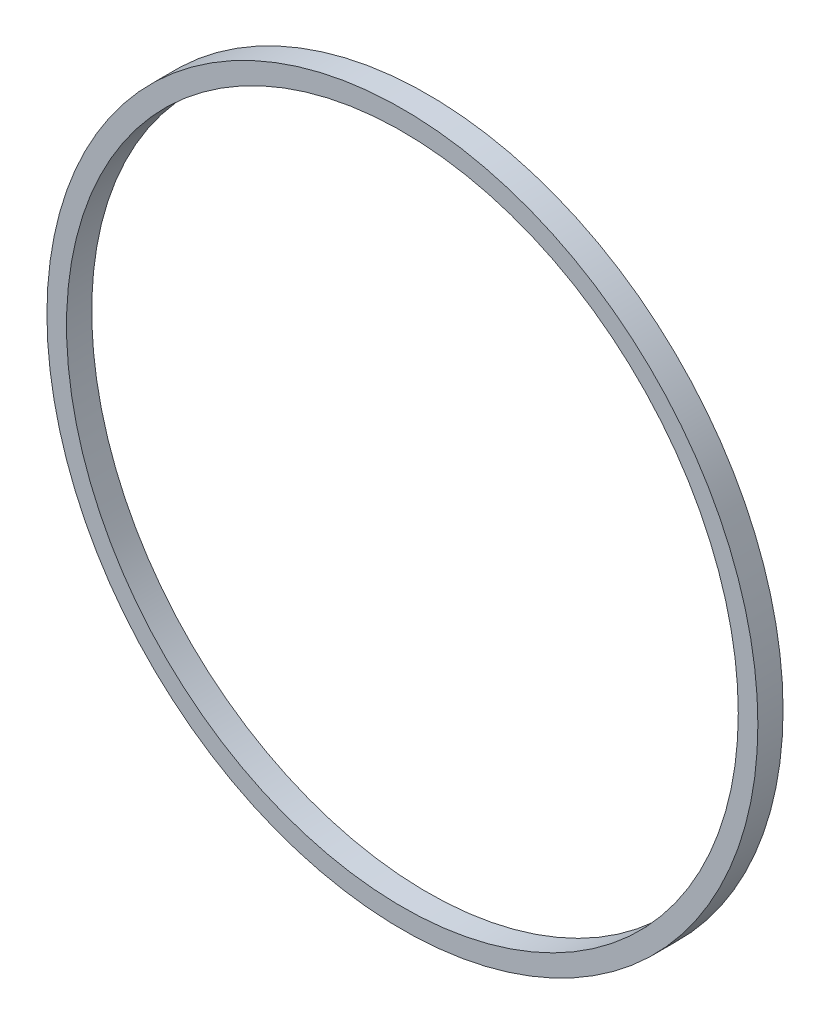
ISO-10303-21;
HEADER;
FILE_DESCRIPTION(('STEP AP214'),'2;1');
FILE_NAME('part.step','',(''),(''),'','','');
FILE_SCHEMA(('AUTOMOTIVE_DESIGN { 1 0 10303 214 1 1 1 1 }'));
ENDSEC;
DATA;
#1=APPLICATION_CONTEXT('core data for automotive mechanical design processes');
#2=APPLICATION_PROTOCOL_DEFINITION('international standard','automotive_design',2000,#1);
#3=PRODUCT_CONTEXT('',#1,'mechanical');
#4=PRODUCT('Part','Part','',(#3));
#5=PRODUCT_RELATED_PRODUCT_CATEGORY('part','',(#4));
#6=PRODUCT_DEFINITION_FORMATION('','',#4);
#7=PRODUCT_DEFINITION_CONTEXT('part definition',#1,'design');
#8=PRODUCT_DEFINITION('design','',#6,#7);
#9=PRODUCT_DEFINITION_SHAPE('','',#8);
#10=(LENGTH_UNIT() NAMED_UNIT(*) SI_UNIT(.MILLI.,.METRE.));
#11=(NAMED_UNIT(*) PLANE_ANGLE_UNIT() SI_UNIT($,.RADIAN.));
#12=(NAMED_UNIT(*) SI_UNIT($,.STERADIAN.) SOLID_ANGLE_UNIT());
#13=UNCERTAINTY_MEASURE_WITH_UNIT(LENGTH_MEASURE(1.E-05),#10,'distance_accuracy_value','');
#14=(GEOMETRIC_REPRESENTATION_CONTEXT(3) GLOBAL_UNCERTAINTY_ASSIGNED_CONTEXT((#13)) GLOBAL_UNIT_ASSIGNED_CONTEXT((#10,
#11,#12)) REPRESENTATION_CONTEXT('',''));
#15=CARTESIAN_POINT('',(0.,0.,0.));
#16=DIRECTION('',(0.,0.,1.));
#17=DIRECTION('',(1.,0.,0.));
#18=AXIS2_PLACEMENT_3D('',#15,#16,#17);
#19=CARTESIAN_POINT('',(70.1311792337737,84.2680326867237,4.5));
#20=DIRECTION('',(0.,0.,-1.));
#21=DIRECTION('',(-1.,0.,0.));
#22=AXIS2_PLACEMENT_3D('',#19,#20,#21);
#23=CYLINDRICAL_SURFACE('',#22,60.);
#24=CARTESIAN_POINT('',(70.1311792337737,84.2680326867237,4.5));
#25=DIRECTION('',(0.,0.,1.));
#26=DIRECTION('',(1.,0.,0.));
#27=AXIS2_PLACEMENT_3D('',#24,#25,#26);
#28=CIRCLE('',#27,60.);
#29=CARTESIAN_POINT('',(130.131179233774,84.2680326867237,4.5));
#30=VERTEX_POINT('',#29);
#31=EDGE_CURVE('E48',#30,#30,#28,.T.);
#32=ORIENTED_EDGE('',*,*,#31,.T.);
#33=EDGE_LOOP('',(#32));
#34=FACE_BOUND('',#33,.T.);
#35=CARTESIAN_POINT('',(70.1311792337737,84.2680326867237,0.));
#36=DIRECTION('',(0.,0.,1.));
#37=DIRECTION('',(1.,0.,0.));
#38=AXIS2_PLACEMENT_3D('',#35,#36,#37);
#39=CIRCLE('',#38,60.);
#40=CARTESIAN_POINT('',(130.131179233774,84.2680326867237,0.));
#41=VERTEX_POINT('',#40);
#42=EDGE_CURVE('E54',#41,#41,#39,.T.);
#43=ORIENTED_EDGE('',*,*,#42,.F.);
#44=EDGE_LOOP('',(#43));
#45=FACE_BOUND('',#44,.T.);
#46=ADVANCED_FACE('F41',(#34,#45),#23,.F.);
#47=CARTESIAN_POINT('',(70.1311792337737,84.2680326867237,4.5));
#48=DIRECTION('',(0.,0.,-1.));
#49=DIRECTION('',(-1.,0.,0.));
#50=AXIS2_PLACEMENT_3D('',#47,#48,#49);
#51=CYLINDRICAL_SURFACE('',#50,63.5);
#52=CARTESIAN_POINT('',(70.1311792337737,84.2680326867237,4.5));
#53=DIRECTION('',(0.,0.,1.));
#54=DIRECTION('',(1.,0.,0.));
#55=AXIS2_PLACEMENT_3D('',#52,#53,#54);
#56=CIRCLE('',#55,63.5);
#57=CARTESIAN_POINT('',(133.631179233774,84.2680326867237,4.5));
#58=VERTEX_POINT('',#57);
#59=EDGE_CURVE('E10',#58,#58,#56,.T.);
#60=ORIENTED_EDGE('',*,*,#59,.F.);
#61=EDGE_LOOP('',(#60));
#62=FACE_BOUND('',#61,.T.);
#63=CARTESIAN_POINT('',(70.1311792337737,84.2680326867237,0.));
#64=DIRECTION('',(0.,0.,1.));
#65=DIRECTION('',(1.,0.,0.));
#66=AXIS2_PLACEMENT_3D('',#63,#64,#65);
#67=CIRCLE('',#66,63.5);
#68=CARTESIAN_POINT('',(133.631179233774,84.2680326867237,0.));
#69=VERTEX_POINT('',#68);
#70=EDGE_CURVE('E44',#69,#69,#67,.T.);
#71=ORIENTED_EDGE('',*,*,#70,.T.);
#72=EDGE_LOOP('',(#71));
#73=FACE_BOUND('',#72,.T.);
#74=ADVANCED_FACE('F61',(#62,#73),#51,.T.);
#75=CARTESIAN_POINT('',(0.,0.,4.5));
#76=DIRECTION('',(0.,0.,1.));
#77=DIRECTION('',(1.,0.,0.));
#78=AXIS2_PLACEMENT_3D('',#75,#76,#77);
#79=PLANE('',#78);
#80=ORIENTED_EDGE('',*,*,#31,.F.);
#81=EDGE_LOOP('',(#80));
#82=FACE_BOUND('',#81,.T.);
#83=ORIENTED_EDGE('',*,*,#59,.T.);
#84=EDGE_LOOP('',(#83));
#85=FACE_BOUND('',#84,.T.);
#86=ADVANCED_FACE('F65',(#82,#85),#79,.T.);
#87=CARTESIAN_POINT('',(0.,0.,0.));
#88=DIRECTION('',(0.,0.,1.));
#89=DIRECTION('',(1.,0.,0.));
#90=AXIS2_PLACEMENT_3D('',#87,#88,#89);
#91=PLANE('',#90);
#92=ORIENTED_EDGE('',*,*,#42,.T.);
#93=EDGE_LOOP('',(#92));
#94=FACE_BOUND('',#93,.T.);
#95=ORIENTED_EDGE('',*,*,#70,.F.);
#96=EDGE_LOOP('',(#95));
#97=FACE_BOUND('',#96,.T.);
#98=ADVANCED_FACE('F63',(#94,#97),#91,.F.);
#99=CLOSED_SHELL('',(#46,#74,#86,#98));
#100=MANIFOLD_SOLID_BREP('B2',#99);
#101=ADVANCED_BREP_SHAPE_REPRESENTATION('',(#18,#100),#14);
#102=SHAPE_DEFINITION_REPRESENTATION(#9,#101);
ENDSEC;
END-ISO-10303-21;
